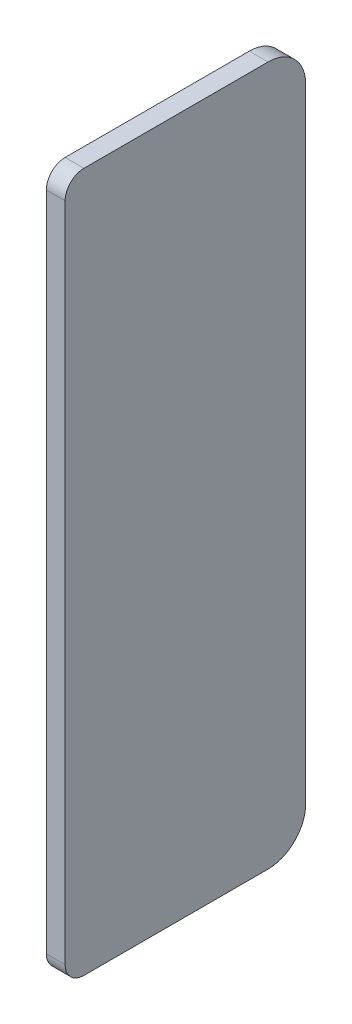
ISO-10303-21;
HEADER;
FILE_DESCRIPTION(('STEP AP214'),'2;1');
FILE_NAME('part.step','',(''),(''),'','','');
FILE_SCHEMA(('AUTOMOTIVE_DESIGN { 1 0 10303 214 1 1 1 1 }'));
ENDSEC;
DATA;
#1=APPLICATION_CONTEXT('core data for automotive mechanical design processes');
#2=APPLICATION_PROTOCOL_DEFINITION('international standard','automotive_design',2000,#1);
#3=PRODUCT_CONTEXT('',#1,'mechanical');
#4=PRODUCT('Part','Part','',(#3));
#5=PRODUCT_RELATED_PRODUCT_CATEGORY('part','',(#4));
#6=PRODUCT_DEFINITION_FORMATION('','',#4);
#7=PRODUCT_DEFINITION_CONTEXT('part definition',#1,'design');
#8=PRODUCT_DEFINITION('design','',#6,#7);
#9=PRODUCT_DEFINITION_SHAPE('','',#8);
#10=(LENGTH_UNIT() NAMED_UNIT(*) SI_UNIT(.MILLI.,.METRE.));
#11=(NAMED_UNIT(*) PLANE_ANGLE_UNIT() SI_UNIT($,.RADIAN.));
#12=(NAMED_UNIT(*) SI_UNIT($,.STERADIAN.) SOLID_ANGLE_UNIT());
#13=UNCERTAINTY_MEASURE_WITH_UNIT(LENGTH_MEASURE(1.E-05),#10,'distance_accuracy_value','');
#14=(GEOMETRIC_REPRESENTATION_CONTEXT(3) GLOBAL_UNCERTAINTY_ASSIGNED_CONTEXT((#13)) GLOBAL_UNIT_ASSIGNED_CONTEXT((#10,
#11,#12)) REPRESENTATION_CONTEXT('',''));
#15=CARTESIAN_POINT('',(0.,0.,0.));
#16=DIRECTION('',(0.,0.,1.));
#17=DIRECTION('',(1.,0.,0.));
#18=AXIS2_PLACEMENT_3D('',#15,#16,#17);
#19=CARTESIAN_POINT('',(0.,33.50000288485,29.5999999225));
#20=DIRECTION('',(1.,0.,0.));
#21=DIRECTION('',(0.,0.,-1.));
#22=AXIS2_PLACEMENT_3D('',#19,#20,#21);
#23=PLANE('',#22);
#24=CARTESIAN_POINT('',(0.,33.20000285055,6.114819761649E-08));
#25=DIRECTION('',(-1.,0.,0.));
#26=DIRECTION('',(0.,0.,1.));
#27=AXIS2_PLACEMENT_3D('',#24,#25,#26);
#28=CIRCLE('',#27,2.0000000343);
#29=CARTESIAN_POINT('',(0.,33.200002850555,-1.99999997315));
#30=VERTEX_POINT('',#29);
#31=CARTESIAN_POINT('',(0.,35.20000288485,1.218612745435E-07));
#32=VERTEX_POINT('',#31);
#33=EDGE_CURVE('E19',#30,#32,#28,.F.);
#34=ORIENTED_EDGE('',*,*,#33,.F.);
#35=DIRECTION('',(0.,1.,0.));
#36=VECTOR('',#35,1.);
#37=CARTESIAN_POINT('',(0.,33.2,-1.99999997315));
#38=LINE('',#37,#36);
#39=CARTESIAN_POINT('',(0.,4.32166559483083E-08,-1.99999997315));
#40=VERTEX_POINT('',#39);
#41=EDGE_CURVE('E92',#30,#40,#38,.F.);
#42=ORIENTED_EDGE('',*,*,#41,.T.);
#43=CARTESIAN_POINT('',(0.,0.,0.));
#44=DIRECTION('',(-1.,0.,0.));
#45=DIRECTION('',(0.,0.,1.));
#46=AXIS2_PLACEMENT_3D('',#43,#44,#45);
#47=CIRCLE('',#46,1.99999997315);
#48=CARTESIAN_POINT('',(0.,-1.99999997315,0.));
#49=VERTEX_POINT('',#48);
#50=EDGE_CURVE('E103',#49,#40,#47,.F.);
#51=ORIENTED_EDGE('',*,*,#50,.F.);
#52=DIRECTION('',(0.,0.,1.));
#53=VECTOR('',#52,1.);
#54=CARTESIAN_POINT('',(0.,-1.99999997315,0.));
#55=LINE('',#54,#53);
#56=CARTESIAN_POINT('',(0.,-1.99999997315,9.80000002685));
#57=VERTEX_POINT('',#56);
#58=EDGE_CURVE('E117',#49,#57,#55,.T.);
#59=ORIENTED_EDGE('',*,*,#58,.T.);
#60=CARTESIAN_POINT('',(0.,-0.9999999731497,9.80000002685));
#61=DIRECTION('',(-1.,0.,0.));
#62=DIRECTION('',(0.,0.,1.));
#63=AXIS2_PLACEMENT_3D('',#60,#61,#62);
#64=CIRCLE('',#63,1.);
#65=CARTESIAN_POINT('',(0.,-0.9999999731497,10.80000002685));
#66=VERTEX_POINT('',#65);
#67=EDGE_CURVE('E145',#66,#57,#64,.F.);
#68=ORIENTED_EDGE('',*,*,#67,.F.);
#69=DIRECTION('',(0.,1.,0.));
#70=VECTOR('',#69,1.);
#71=CARTESIAN_POINT('',(0.,41.84642139714,10.80000002685));
#72=LINE('',#71,#70);
#73=CARTESIAN_POINT('',(0.,34.20000288485,10.80000002685));
#74=VERTEX_POINT('',#73);
#75=EDGE_CURVE('E123',#66,#74,#72,.T.);
#76=ORIENTED_EDGE('',*,*,#75,.T.);
#77=CARTESIAN_POINT('',(0.,34.20000288485,9.80000002685));
#78=DIRECTION('',(1.,0.,0.));
#79=DIRECTION('',(0.,0.,-1.));
#80=AXIS2_PLACEMENT_3D('',#77,#78,#79);
#81=CIRCLE('',#80,1.);
#82=CARTESIAN_POINT('',(0.,35.20000288485,9.80000002685));
#83=VERTEX_POINT('',#82);
#84=EDGE_CURVE('E147',#83,#74,#81,.T.);
#85=ORIENTED_EDGE('',*,*,#84,.F.);
#86=DIRECTION('',(0.,0.,-1.));
#87=VECTOR('',#86,1.);
#88=CARTESIAN_POINT('',(0.,35.20000288485,28.1999999225));
#89=LINE('',#88,#87);
#90=EDGE_CURVE('E94',#83,#32,#89,.T.);
#91=ORIENTED_EDGE('',*,*,#90,.T.);
#92=EDGE_LOOP('',(#34,#42,#51,#59,#68,#76,#85,#91));
#93=FACE_BOUND('',#92,.T.);
#94=ADVANCED_FACE('F16',(#93),#23,.F.);
#95=CARTESIAN_POINT('',(1.,33.20000285055,6.114819761649E-08));
#96=DIRECTION('',(-1.,0.,0.));
#97=DIRECTION('',(0.,0.,1.));
#98=AXIS2_PLACEMENT_3D('',#95,#96,#97);
#99=CYLINDRICAL_SURFACE('',#98,2.0000000343);
#100=DIRECTION('',(1.,0.,0.));
#101=VECTOR('',#100,1.);
#102=CARTESIAN_POINT('',(1.,35.20000288485,1.8257435147051E-07));
#103=LINE('',#102,#101);
#104=CARTESIAN_POINT('',(1.,35.20000288485,1.218612745435E-07));
#105=VERTEX_POINT('',#104);
#106=EDGE_CURVE('E115',#32,#105,#103,.T.);
#107=ORIENTED_EDGE('',*,*,#106,.T.);
#108=CARTESIAN_POINT('',(1.,33.20000285055,6.114819761649E-08));
#109=DIRECTION('',(-1.,0.,0.));
#110=DIRECTION('',(0.,0.,1.));
#111=AXIS2_PLACEMENT_3D('',#108,#109,#110);
#112=CIRCLE('',#111,2.0000000343);
#113=CARTESIAN_POINT('',(1.,33.200002850555,-1.99999997315));
#114=VERTEX_POINT('',#113);
#115=EDGE_CURVE('E101',#114,#105,#112,.F.);
#116=ORIENTED_EDGE('',*,*,#115,.F.);
#117=DIRECTION('',(1.,0.,0.));
#118=VECTOR('',#117,1.);
#119=CARTESIAN_POINT('',(1.,33.20000285056,-1.99999997315));
#120=LINE('',#119,#118);
#121=EDGE_CURVE('E98',#114,#30,#120,.F.);
#122=ORIENTED_EDGE('',*,*,#121,.T.);
#123=ORIENTED_EDGE('',*,*,#33,.T.);
#124=EDGE_LOOP('',(#107,#116,#122,#123));
#125=FACE_BOUND('',#124,.T.);
#126=ADVANCED_FACE('F99',(#125),#99,.T.);
#127=CARTESIAN_POINT('',(1.,35.20000288485,28.1999999225));
#128=DIRECTION('',(0.,-1.,0.));
#129=DIRECTION('',(0.,0.,-1.));
#130=AXIS2_PLACEMENT_3D('',#127,#128,#129);
#131=PLANE('',#130);
#132=ORIENTED_EDGE('',*,*,#106,.F.);
#133=ORIENTED_EDGE('',*,*,#90,.F.);
#134=DIRECTION('',(1.,0.,0.));
#135=VECTOR('',#134,1.);
#136=CARTESIAN_POINT('',(1.,35.20000288485,9.80000002685));
#137=LINE('',#136,#135);
#138=CARTESIAN_POINT('',(1.,35.20000288485,9.80000002685));
#139=VERTEX_POINT('',#138);
#140=EDGE_CURVE('E149',#139,#83,#137,.F.);
#141=ORIENTED_EDGE('',*,*,#140,.F.);
#142=DIRECTION('',(0.,0.,-1.));
#143=VECTOR('',#142,1.);
#144=CARTESIAN_POINT('',(1.,35.20000288485,29.5999999225));
#145=LINE('',#144,#143);
#146=EDGE_CURVE('E142',#105,#139,#145,.F.);
#147=ORIENTED_EDGE('',*,*,#146,.F.);
#148=EDGE_LOOP('',(#132,#133,#141,#147));
#149=FACE_BOUND('',#148,.T.);
#150=ADVANCED_FACE('F260',(#149),#131,.F.);
#151=CARTESIAN_POINT('',(1.,34.20000288485,9.80000002685));
#152=DIRECTION('',(1.,0.,0.));
#153=DIRECTION('',(0.,0.,-1.));
#154=AXIS2_PLACEMENT_3D('',#151,#152,#153);
#155=CYLINDRICAL_SURFACE('',#154,1.);
#156=DIRECTION('',(-1.,0.,0.));
#157=VECTOR('',#156,1.);
#158=CARTESIAN_POINT('',(10.,34.20000288485,10.80000002685));
#159=LINE('',#158,#157);
#160=CARTESIAN_POINT('',(1.,34.20000288485,10.80000002685));
#161=VERTEX_POINT('',#160);
#162=EDGE_CURVE('E127',#74,#161,#159,.F.);
#163=ORIENTED_EDGE('',*,*,#162,.T.);
#164=CARTESIAN_POINT('',(1.,34.20000288485,9.80000002685));
#165=DIRECTION('',(1.,0.,0.));
#166=DIRECTION('',(0.,0.,-1.));
#167=AXIS2_PLACEMENT_3D('',#164,#165,#166);
#168=CIRCLE('',#167,1.);
#169=EDGE_CURVE('E138',#139,#161,#168,.T.);
#170=ORIENTED_EDGE('',*,*,#169,.F.);
#171=ORIENTED_EDGE('',*,*,#140,.T.);
#172=ORIENTED_EDGE('',*,*,#84,.T.);
#173=EDGE_LOOP('',(#163,#170,#171,#172));
#174=FACE_BOUND('',#173,.T.);
#175=ADVANCED_FACE('F207',(#174),#155,.T.);
#176=CARTESIAN_POINT('',(10.,41.84642139714,10.80000002685));
#177=DIRECTION('',(0.,0.,-1.));
#178=DIRECTION('',(-1.,0.,0.));
#179=AXIS2_PLACEMENT_3D('',#176,#177,#178);
#180=PLANE('',#179);
#181=DIRECTION('',(-1.,0.,0.));
#182=VECTOR('',#181,1.);
#183=CARTESIAN_POINT('',(1.,-0.9999999731497,10.80000002685));
#184=LINE('',#183,#182);
#185=CARTESIAN_POINT('',(1.,-0.9999999731497,10.80000002685));
#186=VERTEX_POINT('',#185);
#187=EDGE_CURVE('E126',#186,#66,#184,.T.);
#188=ORIENTED_EDGE('',*,*,#187,.F.);
#189=DIRECTION('',(0.,1.,0.));
#190=VECTOR('',#189,1.);
#191=CARTESIAN_POINT('',(1.,33.50000288485,10.80000002685));
#192=LINE('',#191,#190);
#193=EDGE_CURVE('E137',#161,#186,#192,.F.);
#194=ORIENTED_EDGE('',*,*,#193,.F.);
#195=ORIENTED_EDGE('',*,*,#162,.F.);
#196=ORIENTED_EDGE('',*,*,#75,.F.);
#197=EDGE_LOOP('',(#188,#194,#195,#196));
#198=FACE_BOUND('',#197,.T.);
#199=ADVANCED_FACE('F205',(#198),#180,.F.);
#200=CARTESIAN_POINT('',(1.,-0.9999999731497,9.80000002685));
#201=DIRECTION('',(-1.,0.,0.));
#202=DIRECTION('',(0.,0.,1.));
#203=AXIS2_PLACEMENT_3D('',#200,#201,#202);
#204=CYLINDRICAL_SURFACE('',#203,1.);
#205=ORIENTED_EDGE('',*,*,#187,.T.);
#206=ORIENTED_EDGE('',*,*,#67,.T.);
#207=DIRECTION('',(1.,0.,0.));
#208=VECTOR('',#207,1.);
#209=CARTESIAN_POINT('',(1.,-1.99999997315,9.80000002685));
#210=LINE('',#209,#208);
#211=CARTESIAN_POINT('',(1.,-1.99999997315,9.80000002685));
#212=VERTEX_POINT('',#211);
#213=EDGE_CURVE('E122',#57,#212,#210,.T.);
#214=ORIENTED_EDGE('',*,*,#213,.T.);
#215=CARTESIAN_POINT('',(1.,-0.9999999731497,9.80000002685));
#216=DIRECTION('',(-1.,0.,0.));
#217=DIRECTION('',(0.,0.,1.));
#218=AXIS2_PLACEMENT_3D('',#215,#216,#217);
#219=CIRCLE('',#218,1.);
#220=EDGE_CURVE('E133',#186,#212,#219,.F.);
#221=ORIENTED_EDGE('',*,*,#220,.F.);
#222=EDGE_LOOP('',(#205,#206,#214,#221));
#223=FACE_BOUND('',#222,.T.);
#224=ADVANCED_FACE('F186',(#223),#204,.T.);
#225=CARTESIAN_POINT('',(1.,-1.99999997315,0.));
#226=DIRECTION('',(0.,1.,0.));
#227=DIRECTION('',(0.,0.,1.));
#228=AXIS2_PLACEMENT_3D('',#225,#226,#227);
#229=PLANE('',#228);
#230=DIRECTION('',(-1.,0.,0.));
#231=VECTOR('',#230,1.);
#232=CARTESIAN_POINT('',(1.,-1.99999997315,0.));
#233=LINE('',#232,#231);
#234=CARTESIAN_POINT('',(1.,-1.99999997315,0.));
#235=VERTEX_POINT('',#234);
#236=EDGE_CURVE('E121',#235,#49,#233,.T.);
#237=ORIENTED_EDGE('',*,*,#236,.F.);
#238=DIRECTION('',(0.,0.,-1.));
#239=VECTOR('',#238,1.);
#240=CARTESIAN_POINT('',(1.,-1.99999997315,29.5999999225));
#241=LINE('',#240,#239);
#242=EDGE_CURVE('E132',#212,#235,#241,.T.);
#243=ORIENTED_EDGE('',*,*,#242,.F.);
#244=ORIENTED_EDGE('',*,*,#213,.F.);
#245=ORIENTED_EDGE('',*,*,#58,.F.);
#246=EDGE_LOOP('',(#237,#243,#244,#245));
#247=FACE_BOUND('',#246,.T.);
#248=ADVANCED_FACE('F176',(#247),#229,.F.);
#249=CARTESIAN_POINT('',(1.,0.,0.));
#250=DIRECTION('',(-1.,0.,0.));
#251=DIRECTION('',(0.,0.,1.));
#252=AXIS2_PLACEMENT_3D('',#249,#250,#251);
#253=CYLINDRICAL_SURFACE('',#252,1.99999997315);
#254=DIRECTION('',(1.,0.,0.));
#255=VECTOR('',#254,1.);
#256=CARTESIAN_POINT('',(1.,8.64333118966165E-08,-1.99999997315));
#257=LINE('',#256,#255);
#258=CARTESIAN_POINT('',(1.,4.32166559483083E-08,-1.99999997315));
#259=VERTEX_POINT('',#258);
#260=EDGE_CURVE('E38',#40,#259,#257,.T.);
#261=ORIENTED_EDGE('',*,*,#260,.T.);
#262=CARTESIAN_POINT('',(1.,0.,0.));
#263=DIRECTION('',(-1.,0.,0.));
#264=DIRECTION('',(0.,0.,1.));
#265=AXIS2_PLACEMENT_3D('',#262,#263,#264);
#266=CIRCLE('',#265,1.99999997315);
#267=EDGE_CURVE('E26',#235,#259,#266,.F.);
#268=ORIENTED_EDGE('',*,*,#267,.F.);
#269=ORIENTED_EDGE('',*,*,#236,.T.);
#270=ORIENTED_EDGE('',*,*,#50,.T.);
#271=EDGE_LOOP('',(#261,#268,#269,#270));
#272=FACE_BOUND('',#271,.T.);
#273=ADVANCED_FACE('F177',(#272),#253,.T.);
#274=CARTESIAN_POINT('',(1.,33.2,-1.99999997315));
#275=DIRECTION('',(0.,0.,1.));
#276=DIRECTION('',(1.,0.,0.));
#277=AXIS2_PLACEMENT_3D('',#274,#275,#276);
#278=PLANE('',#277);
#279=ORIENTED_EDGE('',*,*,#260,.F.);
#280=ORIENTED_EDGE('',*,*,#41,.F.);
#281=ORIENTED_EDGE('',*,*,#121,.F.);
#282=DIRECTION('',(0.,1.,0.));
#283=VECTOR('',#282,1.);
#284=CARTESIAN_POINT('',(1.,33.50000288485,-1.99999997315));
#285=LINE('',#284,#283);
#286=EDGE_CURVE('E11',#259,#114,#285,.T.);
#287=ORIENTED_EDGE('',*,*,#286,.F.);
#288=EDGE_LOOP('',(#279,#280,#281,#287));
#289=FACE_BOUND('',#288,.T.);
#290=ADVANCED_FACE('F105',(#289),#278,.F.);
#291=CARTESIAN_POINT('',(1.,33.50000288485,29.5999999225));
#292=DIRECTION('',(1.,0.,0.));
#293=DIRECTION('',(0.,0.,-1.));
#294=AXIS2_PLACEMENT_3D('',#291,#292,#293);
#295=PLANE('',#294);
#296=ORIENTED_EDGE('',*,*,#267,.T.);
#297=ORIENTED_EDGE('',*,*,#286,.T.);
#298=ORIENTED_EDGE('',*,*,#115,.T.);
#299=ORIENTED_EDGE('',*,*,#146,.T.);
#300=ORIENTED_EDGE('',*,*,#169,.T.);
#301=ORIENTED_EDGE('',*,*,#193,.T.);
#302=ORIENTED_EDGE('',*,*,#220,.T.);
#303=ORIENTED_EDGE('',*,*,#242,.T.);
#304=EDGE_LOOP('',(#296,#297,#298,#299,#300,#301,#302,#303));
#305=FACE_BOUND('',#304,.T.);
#306=ADVANCED_FACE('F172',(#305),#295,.T.);
#307=CLOSED_SHELL('',(#94,#126,#150,#175,#199,#224,#248,#273,#290,#306));
#308=MANIFOLD_SOLID_BREP('B1',#307);
#309=ADVANCED_BREP_SHAPE_REPRESENTATION('',(#18,#308),#14);
#310=SHAPE_DEFINITION_REPRESENTATION(#9,#309);
ENDSEC;
END-ISO-10303-21;
